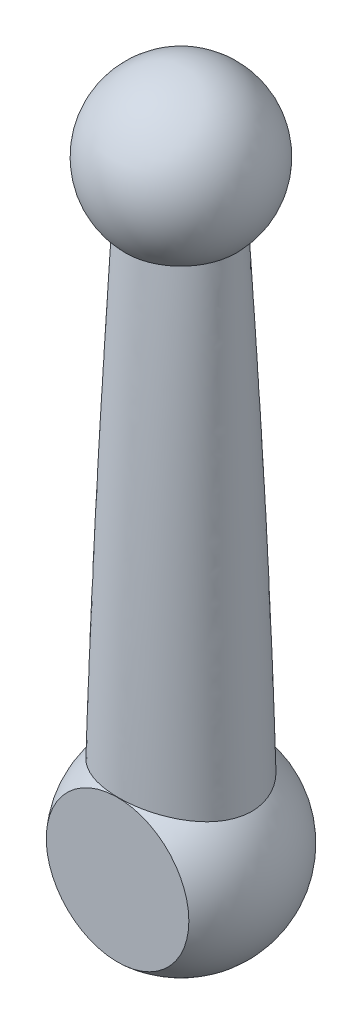
ISO-10303-21;
HEADER;
FILE_DESCRIPTION(('STEP AP214'),'2;1');
FILE_NAME('part.step','',(''),(''),'','','');
FILE_SCHEMA(('AUTOMOTIVE_DESIGN { 1 0 10303 214 1 1 1 1 }'));
ENDSEC;
DATA;
#1=APPLICATION_CONTEXT('core data for automotive mechanical design processes');
#2=APPLICATION_PROTOCOL_DEFINITION('international standard','automotive_design',2000,#1);
#3=PRODUCT_CONTEXT('',#1,'mechanical');
#4=PRODUCT('Part','Part','',(#3));
#5=PRODUCT_RELATED_PRODUCT_CATEGORY('part','',(#4));
#6=PRODUCT_DEFINITION_FORMATION('','',#4);
#7=PRODUCT_DEFINITION_CONTEXT('part definition',#1,'design');
#8=PRODUCT_DEFINITION('design','',#6,#7);
#9=PRODUCT_DEFINITION_SHAPE('','',#8);
#10=(LENGTH_UNIT() NAMED_UNIT(*) SI_UNIT(.MILLI.,.METRE.));
#11=(NAMED_UNIT(*) PLANE_ANGLE_UNIT() SI_UNIT($,.RADIAN.));
#12=(NAMED_UNIT(*) SI_UNIT($,.STERADIAN.) SOLID_ANGLE_UNIT());
#13=UNCERTAINTY_MEASURE_WITH_UNIT(LENGTH_MEASURE(1.E-05),#10,'distance_accuracy_value','');
#14=(GEOMETRIC_REPRESENTATION_CONTEXT(3) GLOBAL_UNCERTAINTY_ASSIGNED_CONTEXT((#13)) GLOBAL_UNIT_ASSIGNED_CONTEXT((#10,
#11,#12)) REPRESENTATION_CONTEXT('',''));
#15=CARTESIAN_POINT('',(0.,0.,0.));
#16=DIRECTION('',(0.,0.,1.));
#17=DIRECTION('',(1.,0.,0.));
#18=AXIS2_PLACEMENT_3D('',#15,#16,#17);
#19=CARTESIAN_POINT('',(4.75809867696496E-13,300.,0.));
#20=DIRECTION('',(0.,-1.,0.));
#21=DIRECTION('',(0.,0.,-1.));
#22=AXIS2_PLACEMENT_3D('',#19,#20,#21);
#23=PLANE('',#22);
#24=CARTESIAN_POINT('',(0.,300.,0.));
#25=DIRECTION('',(0.,1.,0.));
#26=DIRECTION('',(0.,0.,1.));
#27=AXIS2_PLACEMENT_3D('',#24,#25,#26);
#28=CIRCLE('',#27,35.);
#29=CARTESIAN_POINT('',(0.,300.,35.));
#30=VERTEX_POINT('',#29);
#31=EDGE_CURVE('E12',#30,#30,#28,.T.);
#32=ORIENTED_EDGE('',*,*,#31,.F.);
#33=EDGE_LOOP('',(#32));
#34=FACE_BOUND('',#33,.T.);
#35=ADVANCED_FACE('F81',(#34),#23,.T.);
#36=CARTESIAN_POINT('',(0.,335.,0.));
#37=DIRECTION('',(0.,1.,0.));
#38=DIRECTION('',(1.,0.,0.));
#39=AXIS2_PLACEMENT_3D('',#36,#37,#38);
#40=SPHERICAL_SURFACE('',#39,49.4974746830583);
#41=ORIENTED_EDGE('',*,*,#31,.T.);
#42=EDGE_LOOP('',(#41));
#43=FACE_BOUND('',#42,.T.);
#44=ADVANCED_FACE('F88',(#43),#40,.T.);
#45=CLOSED_SHELL('',(#35,#44));
#46=MANIFOLD_SOLID_BREP('B2',#45);
#47=CARTESIAN_POINT('',(0.,-40.,0.));
#48=DIRECTION('',(0.,1.,0.));
#49=DIRECTION('',(-1.,0.,0.));
#50=AXIS2_PLACEMENT_3D('',#47,#48,#49);
#51=SPHERICAL_SURFACE('',#50,60.2089700540165);
#52=CARTESIAN_POINT('',(0.,0.,0.));
#53=DIRECTION('',(0.,1.,0.));
#54=DIRECTION('',(0.999794135075796,0.,0.020290082997406));
#55=AXIS2_PLACEMENT_3D('',#52,#53,#54);
#56=ELLIPSE('',#55,45.0092658290984,40.0082362925319);
#57=CARTESIAN_POINT('',(-44.9942462468034,0.,-0.918714855138773));
#58=VERTEX_POINT('',#57);
#59=CARTESIAN_POINT('',(-45.0028110581604,0.,-0.082160125994335));
#60=VERTEX_POINT('',#59);
#61=EDGE_CURVE('E127',#58,#60,#56,.T.);
#62=ORIENTED_EDGE('',*,*,#61,.F.);
#63=CARTESIAN_POINT('',(-44.980396386586,0.,-1.43107603713787));
#64=VERTEX_POINT('',#63);
#65=EDGE_CURVE('E132',#64,#58,#56,.T.);
#66=ORIENTED_EDGE('',*,*,#65,.F.);
#67=CARTESIAN_POINT('',(-44.9785756597429,0.,-1.43101592801474));
#68=CARTESIAN_POINT('',(-44.9550489805595,0.0029559083120991,-2.0883827264334));
#69=CARTESIAN_POINT('',(-44.913186629816,0.0102921769928422,-2.74505827590611));
#70=CARTESIAN_POINT('',(-44.7932035242483,0.0334900931365863,-4.05470536847865));
#71=CARTESIAN_POINT('',(-44.715095584297,0.0493487277725434,-4.70767813819722));
#72=CARTESIAN_POINT('',(-44.5230280133869,0.0893561682120766,-6.00799142562389));
#73=CARTESIAN_POINT('',(-44.4090724731132,0.113504028134128,-6.65533257731666));
#74=CARTESIAN_POINT('',(-44.1464119342087,0.169629866753646,-7.9400399614201));
#75=CARTESIAN_POINT('',(-43.9978389568473,0.201578118557846,-8.57743451211063));
#76=CARTESIAN_POINT('',(-43.6664469072135,0.272925402817295,-9.84286860148717));
#77=CARTESIAN_POINT('',(-43.4836257919358,0.312324879762056,-10.4709075796709));
#78=CARTESIAN_POINT('',(-43.0846235822151,0.398070702465114,-11.7158124374274));
#79=CARTESIAN_POINT('',(-42.8684421714634,0.444417114091282,-12.3326782109984));
#80=CARTESIAN_POINT('',(-42.4024685100715,0.543757883225594,-13.5568489076678));
#81=CARTESIAN_POINT('',(-42.1525017564363,0.596786652224453,-14.1640845727935));
#82=CARTESIAN_POINT('',(-41.6209758745888,0.708666153401663,-15.364005266172));
#83=CARTESIAN_POINT('',(-41.3394168507106,0.767516866352849,-15.9566903424706));
#84=CARTESIAN_POINT('',(-40.7459116518061,0.890367266235347,-17.1260710822469));
#85=CARTESIAN_POINT('',(-40.4339661161446,0.954366844824061,-17.7027670818241));
#86=CARTESIAN_POINT('',(-39.7807484618074,1.08685009809967,-18.8392441895326));
#87=CARTESIAN_POINT('',(-39.439458089658,1.15533655738028,-19.3990144724179));
#88=CARTESIAN_POINT('',(-38.7290310988654,1.29602390240193,-20.5001178010553));
#89=CARTESIAN_POINT('',(-38.3598943173067,1.36822480987358,-21.0414507389128));
#90=CARTESIAN_POINT('',(-37.595154312564,1.51558148462276,-22.104644584328));
#91=CARTESIAN_POINT('',(-37.1995500900393,1.59073736342796,-22.6265047554853));
#92=CARTESIAN_POINT('',(-36.1299224659536,1.79056044011471,-23.9674295362427));
#93=CARTESIAN_POINT('',(-35.435428852077,1.91701838358802,-24.7700268726059));
#94=CARTESIAN_POINT('',(-33.9865553682289,2.17234085217179,-26.3186026854875));
#95=CARTESIAN_POINT('',(-33.2321734710391,2.30120545863479,-27.0645792437195));
#96=CARTESIAN_POINT('',(-31.6690255534977,2.55806157953926,-28.4981732342704));
#97=CARTESIAN_POINT('',(-30.8602314908948,2.68605260575745,-29.1857601550996));
#98=CARTESIAN_POINT('',(-29.1944670688038,2.93777531511106,-30.5007003948986));
#99=CARTESIAN_POINT('',(-28.337492641541,3.06150663718171,-31.1280486158869));
#100=CARTESIAN_POINT('',(-26.4710586275938,3.31635074115118,-32.3966443858997));
#101=CARTESIAN_POINT('',(-25.4559443430674,3.44644692128841,-33.0297907350197));
#102=CARTESIAN_POINT('',(-23.37857444939,3.69535461925376,-34.2158522349795));
#103=CARTESIAN_POINT('',(-22.3163175917817,3.81416583796491,-34.7687652593756));
#104=CARTESIAN_POINT('',(-20.1513987536506,4.03882230529754,-35.7920301057704));
#105=CARTESIAN_POINT('',(-19.0487352273649,4.14466705721087,-36.2623787652636));
#106=CARTESIAN_POINT('',(-16.8099158378084,4.34160017264771,-37.1189400794622));
#107=CARTESIAN_POINT('',(-15.6737583794472,4.43268783204406,-37.5051487197724));
#108=CARTESIAN_POINT('',(-13.2686641505685,4.60604921897534,-38.2241854836668));
#109=CARTESIAN_POINT('',(-11.9971502346062,4.68673370812498,-38.5487977715006));
#110=CARTESIAN_POINT('',(-9.43114534293716,4.82649001564629,-39.0958493531312));
#111=CARTESIAN_POINT('',(-8.1366529739954,4.88556051878808,-39.3182824294443));
#112=CARTESIAN_POINT('',(-5.53273082525083,4.98054430111796,-39.6609012284042));
#113=CARTESIAN_POINT('',(-4.22329401966671,5.01644618976955,-39.7810366670577));
#114=CARTESIAN_POINT('',(-1.59861522490692,5.06398090232291,-39.9190406699124));
#115=CARTESIAN_POINT('',(-0.283373152096396,5.07561337543083,-39.9369077559177));
#116=CARTESIAN_POINT('',(2.40195310130065,5.07407752266444,-39.8692851949709));
#117=CARTESIAN_POINT('',(3.77192422069646,5.05980406571623,-39.7792483073393));
#118=CARTESIAN_POINT('',(6.49960539297555,5.00443224812139,-39.488710644964));
#119=CARTESIAN_POINT('',(7.85731502251733,4.96333296484605,-39.2882060709088));
#120=CARTESIAN_POINT('',(10.5508160947197,4.85525187154509,-38.7774254618518));
#121=CARTESIAN_POINT('',(11.8866084050895,4.78827108876097,-38.4671537835679));
#122=CARTESIAN_POINT('',(14.526782943621,4.6301378299511,-37.7375783777254));
#123=CARTESIAN_POINT('',(15.8311653571871,4.53898549664174,-37.3182752939226));
#124=CARTESIAN_POINT('',(17.9758281409952,4.36862276006596,-36.5275622140408));
#125=CARTESIAN_POINT('',(18.8276284355588,4.29534768675857,-36.1857707595235));
#126=CARTESIAN_POINT('',(20.5095331752392,4.14001171957503,-35.4539893108104));
#127=CARTESIAN_POINT('',(21.3396373827558,4.05795072953185,-35.0639987890402));
#128=CARTESIAN_POINT('',(22.9749410530343,3.8861235423596,-34.2363492503839));
#129=CARTESIAN_POINT('',(23.7801398042377,3.79635712535967,-33.7986888731643));
#130=CARTESIAN_POINT('',(25.3625161617755,3.61030446535011,-32.8763077450801));
#131=CARTESIAN_POINT('',(26.1396897379154,3.5140172902997,-32.3915802623925));
#132=CARTESIAN_POINT('',(27.662598856326,3.31622146402783,-31.3759951952888));
#133=CARTESIAN_POINT('',(28.4083349930656,3.2147129116211,-30.8451384837389));
#134=CARTESIAN_POINT('',(29.8650154119698,3.00781615295356,-29.7384600734849));
#135=CARTESIAN_POINT('',(30.5759624615265,2.90242825645812,-29.1626419608467));
#136=CARTESIAN_POINT('',(31.9192887426265,2.6953491224292,-28.0024462667423));
#137=CARTESIAN_POINT('',(32.553830464477,2.59380355658594,-27.4205511035404));
#138=CARTESIAN_POINT('',(33.4783000349876,2.44059286750613,-26.5199431734433));
#139=CARTESIAN_POINT('',(33.7819158946007,2.38937097323177,-26.2150948553513));
#140=CARTESIAN_POINT('',(34.379746801738,2.28674747039043,-25.5963228405269));
#141=CARTESIAN_POINT('',(34.6739618159231,2.23534586118682,-25.282399111617));
#142=CARTESIAN_POINT('',(35.2526969828201,2.13246908960021,-24.645694077888));
#143=CARTESIAN_POINT('',(35.5372161258893,2.08099392013528,-24.3229118569032));
#144=CARTESIAN_POINT('',(36.0962123929649,1.97810514215945,-23.6687549546059));
#145=CARTESIAN_POINT('',(36.3706895230009,1.9266915336116,-23.3373802784528));
#146=CARTESIAN_POINT('',(36.9091107928304,1.82423493630059,-22.6662443720234));
#147=CARTESIAN_POINT('',(37.1730573580051,1.77319186443754,-22.326485102392));
#148=CARTESIAN_POINT('',(37.6900525864495,1.67174459495467,-21.6387016775591));
#149=CARTESIAN_POINT('',(37.9431012744702,1.62134039588405,-21.2906775411316));
#150=CARTESIAN_POINT('',(38.6852216878225,1.471515970503,-20.2345549181197));
#151=CARTESIAN_POINT('',(39.157389848007,1.37346050396174,-19.5142543495094));
#152=CARTESIAN_POINT('',(40.0530422695971,1.18322287237948,-18.0434582205587));
#153=CARTESIAN_POINT('',(40.4765360056819,1.09103956586069,-17.2929685751745));
#154=CARTESIAN_POINT('',(41.2332548390392,0.923127388407791,-15.8381924963633));
#155=CARTESIAN_POINT('',(41.5712501423106,0.846669582211431,-15.136471138687));
#156=CARTESIAN_POINT('',(42.2028421563095,0.701599263549397,-13.7124735155366));
#157=CARTESIAN_POINT('',(42.4964373887729,0.6329870123136,-12.9901965666317));
#158=CARTESIAN_POINT('',(43.0372500798373,0.504857792181169,-11.5275265819101));
#159=CARTESIAN_POINT('',(43.284459096977,0.445342479129169,-10.7871302763539));
#160=CARTESIAN_POINT('',(43.7300594747661,0.336655837146813,-9.29327336878065));
#161=CARTESIAN_POINT('',(43.9285845884143,0.287456222357738,-8.53985478964144));
#162=CARTESIAN_POINT('',(44.276234422986,0.200075382346009,-7.02123319301441));
#163=CARTESIAN_POINT('',(44.4253682931172,0.161892116629742,-6.25603238557376));
#164=CARTESIAN_POINT('',(44.6730974023126,0.0972114971489991,-4.71757223764143));
#165=CARTESIAN_POINT('',(44.7717354035656,0.0707042582603059,-3.94432028340266));
#166=CARTESIAN_POINT('',(44.8703001771891,0.0430935542957402,-2.89839688167705));
#167=CARTESIAN_POINT('',(44.8926685038117,0.0366911055173614,-2.62783449670539));
#168=CARTESIAN_POINT('',(44.9311891180544,0.0253593011490731,-2.08629177265851));
#169=CARTESIAN_POINT('',(44.9473429061861,0.0204295900283156,-1.81531155035582));
#170=CARTESIAN_POINT('',(44.9734097179581,0.0120550996604608,-1.2733680811641));
#171=CARTESIAN_POINT('',(44.9833304635731,0.00860848471484729,-1.00240523075833));
#172=CARTESIAN_POINT('',(44.9969587508217,0.00319383085746107,-0.460244070004408));
#173=CARTESIAN_POINT('',(45.0006648140295,0.00122614383283947,-0.189045718980266));
#174=CARTESIAN_POINT('',(45.0012591380375,0.,0.0821642053860849));
#175=B_SPLINE_CURVE_WITH_KNOTS('',3,(#67,#68,#69,#70,#71,#72,#73,#74,#75,#76,#77,#78,#79,#80,
#81,#82,#83,#84,#85,#86,#87,#88,#89,#90,#91,#92,#93,#94,#95,#96,#97,#98,#99,#100,#101,#102,#103,
#104,#105,#106,#107,#108,#109,#110,#111,#112,#113,#114,#115,#116,#117,#118,#119,#120,#121,#122,
#123,#124,#125,#126,#127,#128,#129,#130,#131,#132,#133,#134,#135,#136,#137,#138,#139,#140,#141,
#142,#143,#144,#145,#146,#147,#148,#149,#150,#151,#152,#153,#154,#155,#156,#157,#158,#159,#160,
#161,#162,#163,#164,#165,#166,#167,#168,#169,#170,#171,#172,#173,#174),.UNSPECIFIED.,.F.,.F.,(4,
2,2,2,2,2,2,2,2,2,2,2,2,2,2,2,2,2,2,2,2,2,2,2,2,2,2,2,2,2,2,2,2,2,2,2,2,2,2,2,2,2,2,2,2,2,2,2,2,
2,2,2,2,4),(0.,1.97309167113051,3.94548627325966,5.91765588068661,7.88242385318868,
9.84730906740161,11.8122129129965,13.7876837908884,15.763148144939,17.7385709420708,
19.7152315333357,21.6919036899549,23.6686505226543,26.8717199142889,30.0748977760792,
33.2797392878961,36.4848517857934,40.0914163996571,43.6980765817519,47.3048748814823,
50.9118452271044,54.8516981601821,58.7917907968914,62.7338190541703,66.6759042897347,
70.7901245461436,74.9044863116249,79.0186847941004,83.1328589856046,85.8936578599771,
88.6544869560033,91.4153948572345,94.1766982235568,96.9379493513419,99.69898046966,
102.298088239727,103.597790103484,104.897496575992,106.197337977491,107.497178598501,
108.796718093565,110.096254636979,112.69474002671,115.292718750736,117.639074796667,
119.985508945412,122.332369689929,124.672708612935,127.012613770006,129.350534097828,
130.16516684868,130.979602781351,131.793027727928,132.606646154695),.UNSPECIFIED.);
#176=CARTESIAN_POINT('',(45.0028161405673,0.,0.0821601808019422));
#177=VERTEX_POINT('',#176);
#178=EDGE_CURVE('E119',#64,#177,#175,.T.);
#179=ORIENTED_EDGE('',*,*,#178,.T.);
#180=CARTESIAN_POINT('',(44.9943613107745,0.,0.913124295464952));
#181=VERTEX_POINT('',#180);
#182=EDGE_CURVE('E144',#181,#177,#56,.T.);
#183=ORIENTED_EDGE('',*,*,#182,.F.);
#184=CARTESIAN_POINT('',(44.9803930902102,0.,1.43107601494558));
#185=VERTEX_POINT('',#184);
#186=EDGE_CURVE('E149',#185,#181,#56,.T.);
#187=ORIENTED_EDGE('',*,*,#186,.F.);
#188=CARTESIAN_POINT('',(44.9785756597432,0.,1.43101592800522));
#189=CARTESIAN_POINT('',(44.9550474002823,0.00295283849975748,2.08851838538103));
#190=CARTESIAN_POINT('',(44.9131811187595,0.0102819694836697,2.74532974453121));
#191=CARTESIAN_POINT('',(44.7931840186687,0.0334590086708085,4.0552499550692));
#192=CARTESIAN_POINT('',(44.7150659328715,0.0493039261714116,4.70836002500671));
#193=CARTESIAN_POINT('',(44.5229705517968,0.0892788609992494,6.00894808230809));
#194=CARTESIAN_POINT('',(44.408997322371,0.113407938959122,6.65642669970879));
#195=CARTESIAN_POINT('',(44.1462909472694,0.16949374167208,7.94141298078799));
#196=CARTESIAN_POINT('',(43.9976895525791,0.201420818734073,8.57894890142222));
#197=CARTESIAN_POINT('',(43.6662288648006,0.272725588664397,9.84466278510575));
#198=CARTESIAN_POINT('',(43.4833675478072,0.312103721705324,10.4728401929329));
#199=CARTESIAN_POINT('',(43.0842712507448,0.397809246826295,11.7180174136886));
#200=CARTESIAN_POINT('',(42.8680359613603,0.444136703313717,12.3350171229613));
#201=CARTESIAN_POINT('',(42.4019460985066,0.543442711481517,13.5594311659809));
#202=CARTESIAN_POINT('',(42.1519179386719,0.59645550328744,14.1667766031895));
#203=CARTESIAN_POINT('',(41.6202546035497,0.70830956037656,15.366909000887));
#204=CARTESIAN_POINT('',(41.3386195263034,0.767150807580474,15.9596960065275));
#205=CARTESIAN_POINT('',(40.7449470228221,0.889990356147203,17.1292704234533));
#206=CARTESIAN_POINT('',(40.432910235608,0.953988549110049,17.7060581707036));
#207=CARTESIAN_POINT('',(39.779496392821,1.08647779238642,18.8427038520627));
#208=CARTESIAN_POINT('',(39.438101213335,1.15497161173339,19.4025510357325));
#209=CARTESIAN_POINT('',(38.7274502456831,1.29568313465516,20.5037942850406));
#210=CARTESIAN_POINT('',(38.358194294607,1.36790086000396,21.0451902427622));
#211=CARTESIAN_POINT('',(37.5932027471484,1.51530043497335,22.1084947722352));
#212=CARTESIAN_POINT('',(37.1974661576449,1.59048239572016,22.6304026119658));
#213=CARTESIAN_POINT('',(36.127725251433,1.79033861931097,23.9711188838354));
#214=CARTESIAN_POINT('',(35.4332659618801,1.91680848306242,24.7734669627209));
#215=CARTESIAN_POINT('',(33.9844803639633,2.17217184912987,26.3215443556266));
#216=CARTESIAN_POINT('',(33.230152038542,2.30106543299208,27.067271760373));
#217=CARTESIAN_POINT('',(31.6671307184098,2.55799378634218,28.5003722348869));
#218=CARTESIAN_POINT('',(30.8584096277839,2.68602807383306,29.1877147253638));
#219=CARTESIAN_POINT('',(29.192812576138,2.93784699017646,30.5021757984373));
#220=CARTESIAN_POINT('',(28.3359325482163,3.06163125869932,31.1292892826951));
#221=CARTESIAN_POINT('',(26.4697024776448,3.31659917368016,32.3974124597141));
#222=CARTESIAN_POINT('',(25.454699448289,3.44676714038217,33.0303212624929));
#223=CARTESIAN_POINT('',(23.3775753350715,3.69582473777373,34.2159271095185));
#224=CARTESIAN_POINT('',(22.3154530044949,3.81471406978387,34.7686220297564));
#225=CARTESIAN_POINT('',(20.1508265317152,4.03952505945325,35.7914805015863));
#226=CARTESIAN_POINT('',(19.0483208470367,4.14544622111015,36.2616408967228));
#227=CARTESIAN_POINT('',(16.8098379249501,4.34252459994487,37.1178642074566));
#228=CARTESIAN_POINT('',(15.6738590892078,4.43368111075979,37.5039230998171));
#229=CARTESIAN_POINT('',(13.2689027321954,4.60719144764355,38.2227708933396));
#230=CARTESIAN_POINT('',(11.9973432786899,4.68795082557718,38.5473279287478));
#231=CARTESIAN_POINT('',(9.43125370426537,4.82782734370307,39.0942910006606));
#232=CARTESIAN_POINT('',(8.13672218837689,4.88694316485101,39.3166908115083));
#233=CARTESIAN_POINT('',(5.53272415803623,4.98198401545155,39.6592704948229));
#234=CARTESIAN_POINT('',(4.22325060442517,5.01789761306797,39.7793999875077));
#235=CARTESIAN_POINT('',(1.59849873006925,5.06542059215985,39.9174212520302));
#236=CARTESIAN_POINT('',(0.283220325099354,5.07702961982061,39.9353115355234));
#237=CARTESIAN_POINT('',(-2.40245112872514,5.07541119591942,39.8677578916211));
#238=CARTESIAN_POINT('',(-3.77273071891342,5.06107183255586,39.7777462896033));
#239=CARTESIAN_POINT('',(-6.50102865508321,5.00552616124256,39.4872402682213));
#240=CARTESIAN_POINT('',(-7.85904657565744,4.96431892474045,39.2867420304816));
#241=CARTESIAN_POINT('',(-10.5531635623709,4.85598923654252,38.7759446994538));
#242=CARTESIAN_POINT('',(-11.8892634327756,4.78886773797738,38.4656496445451));
#243=CARTESIAN_POINT('',(-14.5300413068473,4.63043360995627,37.7359853995352));
#244=CARTESIAN_POINT('',(-15.8347195024013,4.53912112827151,37.3166168757121));
#245=CARTESIAN_POINT('',(-17.9797876763822,4.3684938232434,36.525773386375));
#246=CARTESIAN_POINT('',(-18.8317052940562,4.29511595300178,36.1839363401184));
#247=CARTESIAN_POINT('',(-20.5138347244562,4.13957946242449,35.4520422411002));
#248=CARTESIAN_POINT('',(-21.3440462968277,4.0574207449083,35.0619846546585));
#249=CARTESIAN_POINT('',(-22.9795509449145,3.88540878530091,34.2341751353299));
#250=CARTESIAN_POINT('',(-23.7848432928624,3.79555531877231,33.7964218111711));
#251=CARTESIAN_POINT('',(-25.3673799325857,3.60934251964465,32.8738345684113));
#252=CARTESIAN_POINT('',(-26.1446205367327,3.51298233643071,32.3889944905732));
#253=CARTESIAN_POINT('',(-27.6676339803773,3.31507383805491,31.3731433704556));
#254=CARTESIAN_POINT('',(-28.4134074419556,3.21352562554415,30.8421332415575));
#255=CARTESIAN_POINT('',(-29.8701236933747,3.00659079552539,29.7351052444997));
#256=CARTESIAN_POINT('',(-30.5810693174844,2.90120449157997,29.1590910486773));
#257=CARTESIAN_POINT('',(-31.9240275681221,2.69421094664708,27.9987692592799));
#258=CARTESIAN_POINT('',(-32.558221822428,2.59274865143345,27.4169654215378));
#259=CARTESIAN_POINT('',(-33.4821726670737,2.43968527003709,26.5165037098336));
#260=CARTESIAN_POINT('',(-33.7856161257241,2.3885161969231,26.2117055574038));
#261=CARTESIAN_POINT('',(-34.3831045840391,2.28600335758974,25.5930389634532));
#262=CARTESIAN_POINT('',(-34.6771495496943,2.23465959073897,25.2791704891184));
#263=CARTESIAN_POINT('',(-35.2555492008264,2.13190049637938,24.642583129936));
#264=CARTESIAN_POINT('',(-35.5399028737331,2.0804851619736,24.3198633265984));
#265=CARTESIAN_POINT('',(-36.0985740549968,1.9777163828218,23.6658395052199));
#266=CARTESIAN_POINT('',(-36.3728915697249,1.92636293803652,23.3345354926286));
#267=CARTESIAN_POINT('',(-36.9110062010502,1.82402364802194,22.6635446204039));
#268=CARTESIAN_POINT('',(-37.1748055564508,1.7730377264781,22.3238595698727));
#269=CARTESIAN_POINT('',(-37.6915162088945,1.67169978610339,21.6362353645968));
#270=CARTESIAN_POINT('',(-37.944427530088,1.62134776586666,21.2882962281628));
#271=CARTESIAN_POINT('',(-38.6861527075737,1.47167023065311,20.2324454473108));
#272=CARTESIAN_POINT('',(-39.1580798114775,1.37369985363641,19.5123485716215));
#273=CARTESIAN_POINT('',(-40.0533011549135,1.18360385559537,18.0419991062931));
#274=CARTESIAN_POINT('',(-40.4766048096946,1.09147710458715,17.291752392855));
#275=CARTESIAN_POINT('',(-41.233161142878,0.923611386950715,15.8371878885388));
#276=CARTESIAN_POINT('',(-41.5711616902261,0.847148883036228,15.135422776563));
#277=CARTESIAN_POINT('',(-42.2027736254891,0.702051619324851,13.7113440960821));
#278=CARTESIAN_POINT('',(-42.4963835404365,0.633417119294904,12.9890298466612));
#279=CARTESIAN_POINT('',(-43.0372312522098,0.505231241224249,11.5262874593805));
#280=CARTESIAN_POINT('',(-43.2844605984351,0.445681518810477,10.7858560482774));
#281=CARTESIAN_POINT('',(-43.7300974094787,0.336922973914419,9.2919379267183));
#282=CARTESIAN_POINT('',(-43.9286392852705,0.287685738044126,8.53849344848047));
#283=CARTESIAN_POINT('',(-44.2763164378726,0.200232898933446,7.01981748881882));
#284=CARTESIAN_POINT('',(-44.4254608754371,0.162015252280737,6.25458822046142));
#285=CARTESIAN_POINT('',(-44.6731991830603,0.0972755517756588,4.71606882482519));
#286=CARTESIAN_POINT('',(-44.7718358648121,0.070743595504278,3.942786093122));
#287=CARTESIAN_POINT('',(-44.8703747970687,0.0431128426123917,2.89696248596155));
#288=CARTESIAN_POINT('',(-44.8927288199594,0.0367080835084699,2.62653145479134));
#289=CARTESIAN_POINT('',(-44.9312253513874,0.0253719310573828,2.08525171523893));
#290=CARTESIAN_POINT('',(-44.9473693583289,0.0204401823543088,1.81440312346496));
#291=CARTESIAN_POINT('',(-44.9734211668117,0.0120619523313567,1.27272067672701));
#292=CARTESIAN_POINT('',(-44.9833366323718,0.00861364733588408,1.00188721528911));
#293=CARTESIAN_POINT('',(-44.9969586358867,0.00319606196334382,0.459984991596717));
#294=CARTESIAN_POINT('',(-45.000663697412,0.00122713334694018,0.188916188713532));
#295=CARTESIAN_POINT('',(-45.0012591380375,0.,-0.082164205378469));
#296=B_SPLINE_CURVE_WITH_KNOTS('',3,(#188,#189,#190,#191,#192,#193,#194,#195,#196,#197,#198,
#199,#200,#201,#202,#203,#204,#205,#206,#207,#208,#209,#210,#211,#212,#213,#214,#215,#216,#217,
#218,#219,#220,#221,#222,#223,#224,#225,#226,#227,#228,#229,#230,#231,#232,#233,#234,#235,#236,
#237,#238,#239,#240,#241,#242,#243,#244,#245,#246,#247,#248,#249,#250,#251,#252,#253,#254,#255,
#256,#257,#258,#259,#260,#261,#262,#263,#264,#265,#266,#267,#268,#269,#270,#271,#272,#273,#274,
#275,#276,#277,#278,#279,#280,#281,#282,#283,#284,#285,#286,#287,#288,#289,#290,#291,#292,#293,
#294,#295),.UNSPECIFIED.,.F.,.F.,(4,2,2,2,2,2,2,2,2,2,2,2,2,2,2,2,2,2,2,2,2,2,2,2,2,2,2,2,2,2,2,
2,2,2,2,2,2,2,2,2,2,2,2,2,2,2,2,2,2,2,2,2,2,4),(0.,1.97349867534588,3.94630472006208,
5.91888713585571,7.88408352540004,9.84939604557323,11.8147267816847,13.7905665372923,
15.7664001642353,17.7421922696131,19.7192129756624,21.6962452428323,23.6733516975621,
26.8757974467077,30.0783511358019,33.2825719613484,36.4870637830906,40.0929967031836,
43.6990250885055,47.3051913529668,50.911530090873,54.8514891495825,58.7916882850958,
62.7338272962575,66.6760236948608,70.7911631808862,74.906444893466,79.0215752597465,
83.1366804892336,85.8978794400848,88.6591089531967,91.4204190322098,94.1820907953068,
96.9437079367143,99.7050999647199,102.303231987231,103.602446861889,104.901666437354,
106.201021344928,107.500375427632,108.799451448458,110.098524587698,112.696083292597,
115.293138165749,117.639620985712,119.986181649456,122.333169445283,124.673603090782,
127.013602459553,129.351615086764,130.165851913758,130.979892151505,131.792928766831,
132.606158641882),.UNSPECIFIED.);
#297=EDGE_CURVE('E79',#185,#60,#296,.T.);
#298=ORIENTED_EDGE('',*,*,#297,.T.);
#299=EDGE_LOOP('',(#62,#66,#179,#183,#187,#298));
#300=FACE_BOUND('',#299,.T.);
#301=CARTESIAN_POINT('',(0.,-40.,40.));
#302=DIRECTION('',(0.,0.,1.));
#303=DIRECTION('',(1.,0.,0.));
#304=AXIS2_PLACEMENT_3D('',#301,#302,#303);
#305=CIRCLE('',#304,45.0013341465056);
#306=CARTESIAN_POINT('',(45.0013341465056,-40.,40.));
#307=VERTEX_POINT('',#306);
#308=EDGE_CURVE('E114',#307,#307,#305,.F.);
#309=ORIENTED_EDGE('',*,*,#308,.T.);
#310=EDGE_LOOP('',(#309));
#311=FACE_BOUND('',#310,.T.);
#312=ADVANCED_FACE('F107',(#300,#311),#51,.T.);
#313=CARTESIAN_POINT('',(0.,300.,0.));
#314=DIRECTION('',(0.,1.,0.));
#315=DIRECTION('',(0.,0.,1.));
#316=AXIS2_PLACEMENT_3D('',#313,#314,#315);
#317=PLANE('',#316);
#318=CARTESIAN_POINT('',(0.,300.,0.));
#319=DIRECTION('',(0.,1.,0.));
#320=DIRECTION('',(1.,0.,0.));
#321=AXIS2_PLACEMENT_3D('',#318,#319,#320);
#322=ELLIPSE('',#321,35.,25.);
#323=CARTESIAN_POINT('',(35.,300.,0.));
#324=VERTEX_POINT('',#323);
#325=EDGE_CURVE('E212',#324,#324,#322,.T.);
#326=ORIENTED_EDGE('',*,*,#325,.T.);
#327=EDGE_LOOP('',(#326));
#328=FACE_BOUND('',#327,.T.);
#329=ADVANCED_FACE('F170',(#328),#317,.T.);
#330=CARTESIAN_POINT('',(-27.2047212138021,300.,15.7289403044734));
#331=CARTESIAN_POINT('',(-29.1515309989363,250.014437481933,17.6324499641461));
#332=CARTESIAN_POINT('',(-32.5188687463554,150.043309438261,20.9435587237319));
#333=CARTESIAN_POINT('',(-34.8352835121785,50.0144374819336,23.264472104014));
#334=CARTESIAN_POINT('',(-35.7303499836654,0.,24.1769735142752));
#335=CARTESIAN_POINT('',(-27.8123938908977,300.,15.1927012338066));
#336=CARTESIAN_POINT('',(-29.7646462485958,250.013354093001,16.9923105859492));
#337=CARTESIAN_POINT('',(-33.1618762676333,150.044392827375,20.1408043099603));
#338=CARTESIAN_POINT('',(-35.5470419075737,50.0133540930006,22.3947104740882));
#339=CARTESIAN_POINT('',(-36.4855872754047,0.,23.2972324310026));
#340=CARTESIAN_POINT('',(-28.9553571556255,300.,14.0950716776843));
#341=CARTESIAN_POINT('',(-30.914128775874,250.011256254823,15.6826010614986));
#342=CARTESIAN_POINT('',(-34.3632967985104,150.046490665902,18.5043685470734));
#343=CARTESIAN_POINT('',(-36.8783085746703,50.0112562548226,20.6196084008048));
#344=CARTESIAN_POINT('',(-37.9018026517263,0.,21.5001338596697));
#345=CARTESIAN_POINT('',(-30.4539943005254,300.,12.3822513309485));
#346=CARTESIAN_POINT('',(-32.409550795319,250.008445984099,13.6478301206667));
#347=CARTESIAN_POINT('',(-35.9126421894882,150.049300937095,15.9664543024028));
#348=CARTESIAN_POINT('',(-38.6039028262297,50.0084459840985,17.8636200687894));
#349=CARTESIAN_POINT('',(-39.7455072101591,0.,18.7061101000601));
#350=CARTESIAN_POINT('',(-31.7381622094321,300.,10.6121332034738));
#351=CARTESIAN_POINT('',(-33.6779176618627,250.006035210253,11.5511826045755));
#352=CARTESIAN_POINT('',(-37.2120066242968,150.051711711342,13.3591662010367));
#353=CARTESIAN_POINT('',(-40.0597212748689,50.0060352102533,15.0287140091457));
#354=CARTESIAN_POINT('',(-41.3107523779642,0.,15.8281837495927));
#355=CARTESIAN_POINT('',(-38.1643853441046,300.,-0.297892854928234));
#356=CARTESIAN_POINT('',(-39.9395026484948,249.993492375511,-1.32862313915164));
#357=CARTESIAN_POINT('',(-43.5208087229947,150.064254548176,-2.62631921098023));
#358=CARTESIAN_POINT('',(-47.1905715089742,49.9934923755118,-2.37139937428628));
#359=CARTESIAN_POINT('',(-49.0444217335577,0.,-1.85595002784247));
#360=CARTESIAN_POINT('',(-34.0322716091993,300.,-12.4871131287658));
#361=CARTESIAN_POINT('',(-35.0185448696739,250.021594688056,-15.5434797670803));
#362=CARTESIAN_POINT('',(-37.690817318029,150.036152230945,-19.7963129995854));
#363=CARTESIAN_POINT('',(-41.1802286342693,50.0215946880561,-21.2067397980224));
#364=CARTESIAN_POINT('',(-43.1439769286676,0.,-21.2046776895672));
#365=CARTESIAN_POINT('',(-7.00582244759195,300.,-28.1129819683676));
#366=CARTESIAN_POINT('',(-6.21603672978583,250.038907180007,-32.8112661864803));
#367=CARTESIAN_POINT('',(-5.32522263474533,150.018839736108,-40.6846450593004));
#368=CARTESIAN_POINT('',(-6.53498301870027,50.0389071800067,-44.403653588387));
#369=CARTESIAN_POINT('',(-7.64776729024466,0.,-45.2232199282423));
#370=CARTESIAN_POINT('',(15.0512676718895,300.,-26.4537217178096));
#371=CARTESIAN_POINT('',(16.9010623420824,250.019220864733,-30.2255259193597));
#372=CARTESIAN_POINT('',(19.6963522204327,150.038526054664,-37.0932014533147));
#373=CARTESIAN_POINT('',(20.513068583305,50.0192208647326,-40.68017451182));
#374=CARTESIAN_POINT('',(20.625604148879,0.,-41.7717951797274));
#375=CARTESIAN_POINT('',(39.3581747557147,300.,-5.0041588911371));
#376=CARTESIAN_POINT('',(41.4019996557903,250.009654099134,-5.03937400893247));
#377=CARTESIAN_POINT('',(45.3413852722781,150.048092821858,-4.79391599414904));
#378=CARTESIAN_POINT('',(49.157498441052,50.0096540991346,-5.84876969620795));
#379=CARTESIAN_POINT('',(50.8350958184518,0.,-6.58215184882298));
#380=CARTESIAN_POINT('',(37.0352104049335,300.,10.7509054799211));
#381=CARTESIAN_POINT('',(38.2130565825052,250.019773648811,13.5257994293178));
#382=CARTESIAN_POINT('',(41.2693842447851,150.037973270494,17.5200069418517));
#383=CARTESIAN_POINT('',(45.0706608697184,50.0197736488106,18.6390400834295));
#384=CARTESIAN_POINT('',(47.0880002218257,0.,18.5359507741589));
#385=CARTESIAN_POINT('',(10.0087612433261,300.,26.376774319523));
#386=CARTESIAN_POINT('',(9.42092898749851,250.036901513013,30.9718531728103));
#387=CARTESIAN_POINT('',(8.93548802999731,150.020845403436,38.3280234935443));
#388=CARTESIAN_POINT('',(10.3516863534548,50.036901513013,41.8184306019885));
#389=CARTESIAN_POINT('',(11.5917905834028,0.,42.554493012834));
#390=CARTESIAN_POINT('',(-7.54255801429534,300.,26.7242538506615));
#391=CARTESIAN_POINT('',(-9.04235140720961,250.044578903805,30.9556157065652));
#392=CARTESIAN_POINT('',(-11.1132698795726,150.013168011364,37.8140998517798));
#393=CARTESIAN_POINT('',(-11.3349516276971,50.0445789038054,41.4551998224709));
#394=CARTESIAN_POINT('',(-10.9865217943857,0.,42.4759420619409));
#395=CARTESIAN_POINT('',(-21.1427688405546,300.,19.9620087328981));
#396=CARTESIAN_POINT('',(-22.9871389167502,250.024506493413,22.7226687125869));
#397=CARTESIAN_POINT('',(-25.9986493957925,150.033240425103,27.3514842525317));
#398=CARTESIAN_POINT('',(-27.6537025908412,50.0245064934127,30.1929484636485));
#399=CARTESIAN_POINT('',(-28.1424193354626,0.,31.1673674769019));
#400=CARTESIAN_POINT('',(-23.299044669884,300.,18.6961168134988));
#401=CARTESIAN_POINT('',(-25.1901862460442,250.02115636764,21.1915660700419));
#402=CARTESIAN_POINT('',(-28.3404467075579,150.036590551435,25.4154212878876));
#403=CARTESIAN_POINT('',(-30.2261443123433,50.0211563676396,28.1038741447848));
#404=CARTESIAN_POINT('',(-30.8530804395434,0.,29.0644878518886));
#405=CARTESIAN_POINT('',(-25.3321849996274,300.,17.2923299106599));
#406=CARTESIAN_POINT('',(-27.2583011844927,250.01775658842,19.5032611396549));
#407=CARTESIAN_POINT('',(-30.5287289669639,150.039990331221,23.288925435117));
#408=CARTESIAN_POINT('',(-32.6361742814345,50.0177565884205,25.8050776005623));
#409=CARTESIAN_POINT('',(-33.3987949804257,0.,26.7454797795083));
#410=CARTESIAN_POINT('',(-26.5970485367065,300.,16.2651793751402));
#411=CARTESIAN_POINT('',(-28.5384157492768,250.015520870866,18.272589342343));
#412=CARTESIAN_POINT('',(-31.8758612250775,150.042226049147,21.7463131375034));
#413=CARTESIAN_POINT('',(-34.1235251167833,50.0155208708666,24.1342337339397));
#414=CARTESIAN_POINT('',(-34.9751126919261,0.,25.0567145975478));
#415=CARTESIAN_POINT('',(-27.2047212138021,300.,15.7289403044734));
#416=CARTESIAN_POINT('',(-29.1515309989363,250.014437481933,17.6324499641461));
#417=CARTESIAN_POINT('',(-32.5188687463554,150.043309438261,20.9435587237319));
#418=CARTESIAN_POINT('',(-34.8352835121785,50.0144374819336,23.264472104014));
#419=CARTESIAN_POINT('',(-35.7303499836654,0.,24.1769735142752));
#420=B_SPLINE_SURFACE_WITH_KNOTS('',3,3,((#330,#331,#332,#333,#334),(#335,#336,#337,#338,#339),
(#340,#341,#342,#343,#344),(#345,#346,#347,#348,#349),(#350,#351,#352,#353,#354),(#355,#356,
#357,#358,#359),(#360,#361,#362,#363,#364),(#365,#366,#367,#368,#369),(#370,#371,#372,#373,
#374),(#375,#376,#377,#378,#379),(#380,#381,#382,#383,#384),(#385,#386,#387,#388,#389),(#390,
#391,#392,#393,#394),(#395,#396,#397,#398,#399),(#400,#401,#402,#403,#404),(#405,#406,#407,#408,
#409),(#410,#411,#412,#413,#414),(#415,#416,#417,#418,#419)),.UNSPECIFIED.,.T.,.F.,.F.,(4,1,1,1,
1,2,2,2,1,1,1,1,4),(4,1,4),(0.,0.0125,0.0249999999999999,0.0375000000000001,0.05,0.25,0.5,0.75,
0.95,0.9625,0.975,0.9875,1.),(0.,0.500144367294469,1.),.UNSPECIFIED.);
#421=ORIENTED_EDGE('',*,*,#297,.F.);
#422=ORIENTED_EDGE('',*,*,#186,.T.);
#423=ORIENTED_EDGE('',*,*,#182,.T.);
#424=ORIENTED_EDGE('',*,*,#178,.F.);
#425=ORIENTED_EDGE('',*,*,#65,.T.);
#426=ORIENTED_EDGE('',*,*,#61,.T.);
#427=EDGE_LOOP('',(#421,#422,#423,#424,#425,#426));
#428=FACE_BOUND('',#427,.T.);
#429=ORIENTED_EDGE('',*,*,#325,.F.);
#430=EDGE_LOOP('',(#429));
#431=FACE_BOUND('',#430,.T.);
#432=ADVANCED_FACE('F109',(#428,#431),#420,.T.);
#433=CARTESIAN_POINT('',(0.,0.,40.));
#434=DIRECTION('',(0.,0.,1.));
#435=DIRECTION('',(1.,0.,0.));
#436=AXIS2_PLACEMENT_3D('',#433,#434,#435);
#437=PLANE('',#436);
#438=ORIENTED_EDGE('',*,*,#308,.F.);
#439=EDGE_LOOP('',(#438));
#440=FACE_BOUND('',#439,.T.);
#441=ADVANCED_FACE('F171',(#440),#437,.T.);
#442=CLOSED_SHELL('',(#312,#329,#432,#441));
#443=MANIFOLD_SOLID_BREP('B7',#442);
#444=ADVANCED_BREP_SHAPE_REPRESENTATION('',(#18,#46,#443),#14);
#445=SHAPE_DEFINITION_REPRESENTATION(#9,#444);
ENDSEC;
END-ISO-10303-21;
